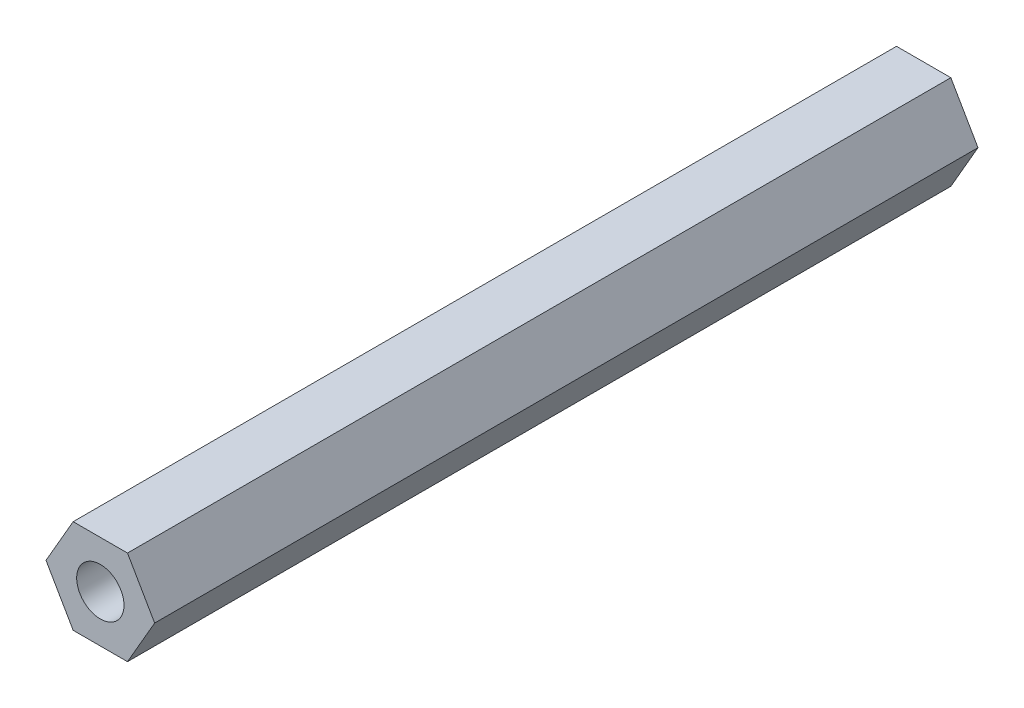
ISO-10303-21;
HEADER;
FILE_DESCRIPTION(('STEP AP214'),'2;1');
FILE_NAME('part.step','',(''),(''),'','','');
FILE_SCHEMA(('AUTOMOTIVE_DESIGN { 1 0 10303 214 1 1 1 1 }'));
ENDSEC;
DATA;
#1=APPLICATION_CONTEXT('core data for automotive mechanical design processes');
#2=APPLICATION_PROTOCOL_DEFINITION('international standard','automotive_design',2000,#1);
#3=PRODUCT_CONTEXT('',#1,'mechanical');
#4=PRODUCT('Part','Part','',(#3));
#5=PRODUCT_RELATED_PRODUCT_CATEGORY('part','',(#4));
#6=PRODUCT_DEFINITION_FORMATION('','',#4);
#7=PRODUCT_DEFINITION_CONTEXT('part definition',#1,'design');
#8=PRODUCT_DEFINITION('design','',#6,#7);
#9=PRODUCT_DEFINITION_SHAPE('','',#8);
#10=(LENGTH_UNIT() NAMED_UNIT(*) SI_UNIT(.MILLI.,.METRE.));
#11=(NAMED_UNIT(*) PLANE_ANGLE_UNIT() SI_UNIT($,.RADIAN.));
#12=(NAMED_UNIT(*) SI_UNIT($,.STERADIAN.) SOLID_ANGLE_UNIT());
#13=UNCERTAINTY_MEASURE_WITH_UNIT(LENGTH_MEASURE(1.E-05),#10,'distance_accuracy_value','');
#14=(GEOMETRIC_REPRESENTATION_CONTEXT(3) GLOBAL_UNCERTAINTY_ASSIGNED_CONTEXT((#13)) GLOBAL_UNIT_ASSIGNED_CONTEXT((#10,
#11,#12)) REPRESENTATION_CONTEXT('',''));
#15=CARTESIAN_POINT('',(0.,0.,0.));
#16=DIRECTION('',(0.,0.,1.));
#17=DIRECTION('',(1.,0.,0.));
#18=AXIS2_PLACEMENT_3D('',#15,#16,#17);
#19=CARTESIAN_POINT('',(2.3094010767585,-4.,70.));
#20=DIRECTION('',(-0.866025403784439,0.5,0.));
#21=DIRECTION('',(-0.5,-0.866025403784439,0.));
#22=AXIS2_PLACEMENT_3D('',#19,#20,#21);
#23=PLANE('',#22);
#24=DIRECTION('',(0.5,0.866025403784439,0.));
#25=VECTOR('',#24,1.);
#26=CARTESIAN_POINT('',(2.3094010767585,-4.,0.));
#27=LINE('',#26,#25);
#28=CARTESIAN_POINT('',(2.3094010767585,-4.,0.));
#29=VERTEX_POINT('',#28);
#30=CARTESIAN_POINT('',(4.61880215351701,0.,0.));
#31=VERTEX_POINT('',#30);
#32=EDGE_CURVE('E133',#29,#31,#27,.T.);
#33=ORIENTED_EDGE('',*,*,#32,.T.);
#34=DIRECTION('',(0.,0.,-1.));
#35=VECTOR('',#34,1.);
#36=CARTESIAN_POINT('',(4.61880215351701,0.,70.));
#37=LINE('',#36,#35);
#38=CARTESIAN_POINT('',(4.61880215351701,0.,70.));
#39=VERTEX_POINT('',#38);
#40=EDGE_CURVE('E11',#39,#31,#37,.T.);
#41=ORIENTED_EDGE('',*,*,#40,.F.);
#42=DIRECTION('',(0.5,0.866025403784439,0.));
#43=VECTOR('',#42,1.);
#44=CARTESIAN_POINT('',(2.3094010767585,-4.,70.));
#45=LINE('',#44,#43);
#46=CARTESIAN_POINT('',(2.3094010767585,-4.,70.));
#47=VERTEX_POINT('',#46);
#48=EDGE_CURVE('E151',#47,#39,#45,.T.);
#49=ORIENTED_EDGE('',*,*,#48,.F.);
#50=DIRECTION('',(0.,0.,-1.));
#51=VECTOR('',#50,1.);
#52=CARTESIAN_POINT('',(2.3094010767585,-4.,70.));
#53=LINE('',#52,#51);
#54=EDGE_CURVE('E128',#47,#29,#53,.T.);
#55=ORIENTED_EDGE('',*,*,#54,.T.);
#56=EDGE_LOOP('',(#33,#41,#49,#55));
#57=FACE_BOUND('',#56,.T.);
#58=ADVANCED_FACE('F44',(#57),#23,.F.);
#59=CARTESIAN_POINT('',(4.61880215351701,0.,70.));
#60=DIRECTION('',(-0.866025403784439,-0.5,0.));
#61=DIRECTION('',(0.5,-0.866025403784439,0.));
#62=AXIS2_PLACEMENT_3D('',#59,#60,#61);
#63=PLANE('',#62);
#64=DIRECTION('',(-0.5,0.866025403784439,0.));
#65=VECTOR('',#64,1.);
#66=CARTESIAN_POINT('',(4.61880215351701,0.,0.));
#67=LINE('',#66,#65);
#68=CARTESIAN_POINT('',(2.3094010767585,4.,0.));
#69=VERTEX_POINT('',#68);
#70=EDGE_CURVE('E136',#31,#69,#67,.T.);
#71=ORIENTED_EDGE('',*,*,#70,.T.);
#72=DIRECTION('',(0.,0.,-1.));
#73=VECTOR('',#72,1.);
#74=CARTESIAN_POINT('',(2.3094010767585,4.,70.));
#75=LINE('',#74,#73);
#76=CARTESIAN_POINT('',(2.3094010767585,4.,70.));
#77=VERTEX_POINT('',#76);
#78=EDGE_CURVE('E53',#77,#69,#75,.T.);
#79=ORIENTED_EDGE('',*,*,#78,.F.);
#80=DIRECTION('',(-0.5,0.866025403784439,0.));
#81=VECTOR('',#80,1.);
#82=CARTESIAN_POINT('',(4.61880215351701,0.,70.));
#83=LINE('',#82,#81);
#84=EDGE_CURVE('E97',#39,#77,#83,.T.);
#85=ORIENTED_EDGE('',*,*,#84,.F.);
#86=ORIENTED_EDGE('',*,*,#40,.T.);
#87=EDGE_LOOP('',(#71,#79,#85,#86));
#88=FACE_BOUND('',#87,.T.);
#89=ADVANCED_FACE('F182',(#88),#63,.F.);
#90=CARTESIAN_POINT('',(2.3094010767585,4.,70.));
#91=DIRECTION('',(0.,-1.,0.));
#92=DIRECTION('',(1.,0.,0.));
#93=AXIS2_PLACEMENT_3D('',#90,#91,#92);
#94=PLANE('',#93);
#95=DIRECTION('',(-1.,0.,0.));
#96=VECTOR('',#95,1.);
#97=CARTESIAN_POINT('',(2.3094010767585,4.,0.));
#98=LINE('',#97,#96);
#99=CARTESIAN_POINT('',(-2.3094010767585,4.,0.));
#100=VERTEX_POINT('',#99);
#101=EDGE_CURVE('E142',#69,#100,#98,.T.);
#102=ORIENTED_EDGE('',*,*,#101,.T.);
#103=DIRECTION('',(0.,0.,-1.));
#104=VECTOR('',#103,1.);
#105=CARTESIAN_POINT('',(-2.3094010767585,4.,70.));
#106=LINE('',#105,#104);
#107=CARTESIAN_POINT('',(-2.3094010767585,4.,70.));
#108=VERTEX_POINT('',#107);
#109=EDGE_CURVE('E121',#108,#100,#106,.T.);
#110=ORIENTED_EDGE('',*,*,#109,.F.);
#111=DIRECTION('',(-1.,0.,0.));
#112=VECTOR('',#111,1.);
#113=CARTESIAN_POINT('',(2.3094010767585,4.,70.));
#114=LINE('',#113,#112);
#115=EDGE_CURVE('E115',#77,#108,#114,.T.);
#116=ORIENTED_EDGE('',*,*,#115,.F.);
#117=ORIENTED_EDGE('',*,*,#78,.T.);
#118=EDGE_LOOP('',(#102,#110,#116,#117));
#119=FACE_BOUND('',#118,.T.);
#120=ADVANCED_FACE('F161',(#119),#94,.F.);
#121=CARTESIAN_POINT('',(-2.3094010767585,4.,70.));
#122=DIRECTION('',(0.866025403784439,-0.5,0.));
#123=DIRECTION('',(0.5,0.866025403784439,0.));
#124=AXIS2_PLACEMENT_3D('',#121,#122,#123);
#125=PLANE('',#124);
#126=DIRECTION('',(-0.5,-0.866025403784439,0.));
#127=VECTOR('',#126,1.);
#128=CARTESIAN_POINT('',(-2.3094010767585,4.,0.));
#129=LINE('',#128,#127);
#130=CARTESIAN_POINT('',(-4.61880215351701,0.,0.));
#131=VERTEX_POINT('',#130);
#132=EDGE_CURVE('E123',#100,#131,#129,.T.);
#133=ORIENTED_EDGE('',*,*,#132,.T.);
#134=DIRECTION('',(0.,0.,-1.));
#135=VECTOR('',#134,1.);
#136=CARTESIAN_POINT('',(-4.61880215351701,0.,70.));
#137=LINE('',#136,#135);
#138=CARTESIAN_POINT('',(-4.61880215351701,0.,70.));
#139=VERTEX_POINT('',#138);
#140=EDGE_CURVE('E119',#139,#131,#137,.T.);
#141=ORIENTED_EDGE('',*,*,#140,.F.);
#142=DIRECTION('',(-0.5,-0.866025403784439,0.));
#143=VECTOR('',#142,1.);
#144=CARTESIAN_POINT('',(-2.3094010767585,4.,70.));
#145=LINE('',#144,#143);
#146=EDGE_CURVE('E106',#108,#139,#145,.T.);
#147=ORIENTED_EDGE('',*,*,#146,.F.);
#148=ORIENTED_EDGE('',*,*,#109,.T.);
#149=EDGE_LOOP('',(#133,#141,#147,#148));
#150=FACE_BOUND('',#149,.T.);
#151=ADVANCED_FACE('F118',(#150),#125,.F.);
#152=CARTESIAN_POINT('',(-4.61880215351701,0.,70.));
#153=DIRECTION('',(0.866025403784439,0.5,0.));
#154=DIRECTION('',(-0.5,0.866025403784439,0.));
#155=AXIS2_PLACEMENT_3D('',#152,#153,#154);
#156=PLANE('',#155);
#157=DIRECTION('',(0.5,-0.866025403784439,0.));
#158=VECTOR('',#157,1.);
#159=CARTESIAN_POINT('',(-4.61880215351701,0.,0.));
#160=LINE('',#159,#158);
#161=CARTESIAN_POINT('',(-2.30940107675851,-4.,0.));
#162=VERTEX_POINT('',#161);
#163=EDGE_CURVE('E84',#131,#162,#160,.T.);
#164=ORIENTED_EDGE('',*,*,#163,.T.);
#165=DIRECTION('',(0.,0.,-1.));
#166=VECTOR('',#165,1.);
#167=CARTESIAN_POINT('',(-2.30940107675851,-4.,70.));
#168=LINE('',#167,#166);
#169=CARTESIAN_POINT('',(-2.30940107675851,-4.,70.));
#170=VERTEX_POINT('',#169);
#171=EDGE_CURVE('E122',#170,#162,#168,.T.);
#172=ORIENTED_EDGE('',*,*,#171,.F.);
#173=DIRECTION('',(0.5,-0.866025403784439,0.));
#174=VECTOR('',#173,1.);
#175=CARTESIAN_POINT('',(-4.61880215351701,0.,70.));
#176=LINE('',#175,#174);
#177=EDGE_CURVE('E109',#139,#170,#176,.T.);
#178=ORIENTED_EDGE('',*,*,#177,.F.);
#179=ORIENTED_EDGE('',*,*,#140,.T.);
#180=EDGE_LOOP('',(#164,#172,#178,#179));
#181=FACE_BOUND('',#180,.T.);
#182=ADVANCED_FACE('F127',(#181),#156,.F.);
#183=CARTESIAN_POINT('',(-2.30940107675851,-4.,70.));
#184=DIRECTION('',(0.,1.,0.));
#185=DIRECTION('',(0.,0.,1.));
#186=AXIS2_PLACEMENT_3D('',#183,#184,#185);
#187=PLANE('',#186);
#188=DIRECTION('',(1.,0.,0.));
#189=VECTOR('',#188,1.);
#190=CARTESIAN_POINT('',(-2.30940107675851,-4.,0.));
#191=LINE('',#190,#189);
#192=EDGE_CURVE('E93',#162,#29,#191,.T.);
#193=ORIENTED_EDGE('',*,*,#192,.T.);
#194=ORIENTED_EDGE('',*,*,#54,.F.);
#195=DIRECTION('',(1.,0.,0.));
#196=VECTOR('',#195,1.);
#197=CARTESIAN_POINT('',(-2.30940107675851,-4.,70.));
#198=LINE('',#197,#196);
#199=EDGE_CURVE('E62',#170,#47,#198,.T.);
#200=ORIENTED_EDGE('',*,*,#199,.F.);
#201=ORIENTED_EDGE('',*,*,#171,.T.);
#202=EDGE_LOOP('',(#193,#194,#200,#201));
#203=FACE_BOUND('',#202,.T.);
#204=ADVANCED_FACE('F169',(#203),#187,.F.);
#205=CARTESIAN_POINT('',(0.,0.,70.));
#206=DIRECTION('',(0.,0.,1.));
#207=DIRECTION('',(1.,0.,0.));
#208=AXIS2_PLACEMENT_3D('',#205,#206,#207);
#209=PLANE('',#208);
#210=CARTESIAN_POINT('',(0.,0.,70.));
#211=DIRECTION('',(0.,0.,1.));
#212=DIRECTION('',(1.,0.,0.));
#213=AXIS2_PLACEMENT_3D('',#210,#211,#212);
#214=CIRCLE('',#213,2.01);
#215=CARTESIAN_POINT('',(2.01,0.,70.));
#216=VERTEX_POINT('',#215);
#217=EDGE_CURVE('E266',#216,#216,#214,.T.);
#218=ORIENTED_EDGE('',*,*,#217,.F.);
#219=EDGE_LOOP('',(#218));
#220=FACE_BOUND('',#219,.T.);
#221=ORIENTED_EDGE('',*,*,#48,.T.);
#222=ORIENTED_EDGE('',*,*,#84,.T.);
#223=ORIENTED_EDGE('',*,*,#115,.T.);
#224=ORIENTED_EDGE('',*,*,#146,.T.);
#225=ORIENTED_EDGE('',*,*,#177,.T.);
#226=ORIENTED_EDGE('',*,*,#199,.T.);
#227=EDGE_LOOP('',(#221,#222,#223,#224,#225,#226));
#228=FACE_BOUND('',#227,.T.);
#229=ADVANCED_FACE('F107',(#220,#228),#209,.T.);
#230=CARTESIAN_POINT('',(0.,0.,0.));
#231=DIRECTION('',(0.,0.,1.));
#232=DIRECTION('',(1.,0.,0.));
#233=AXIS2_PLACEMENT_3D('',#230,#231,#232);
#234=PLANE('',#233);
#235=CARTESIAN_POINT('',(0.,0.,0.));
#236=DIRECTION('',(0.,0.,-1.));
#237=DIRECTION('',(-1.,0.,0.));
#238=AXIS2_PLACEMENT_3D('',#235,#236,#237);
#239=CIRCLE('',#238,2.01);
#240=CARTESIAN_POINT('',(-2.01,0.,0.));
#241=VERTEX_POINT('',#240);
#242=EDGE_CURVE('E264',#241,#241,#239,.T.);
#243=ORIENTED_EDGE('',*,*,#242,.F.);
#244=EDGE_LOOP('',(#243));
#245=FACE_BOUND('',#244,.T.);
#246=ORIENTED_EDGE('',*,*,#32,.F.);
#247=ORIENTED_EDGE('',*,*,#192,.F.);
#248=ORIENTED_EDGE('',*,*,#163,.F.);
#249=ORIENTED_EDGE('',*,*,#132,.F.);
#250=ORIENTED_EDGE('',*,*,#101,.F.);
#251=ORIENTED_EDGE('',*,*,#70,.F.);
#252=EDGE_LOOP('',(#246,#247,#248,#249,#250,#251));
#253=FACE_BOUND('',#252,.T.);
#254=ADVANCED_FACE('F163',(#245,#253),#234,.F.);
#255=CARTESIAN_POINT('',(0.,0.,10.));
#256=DIRECTION('',(0.,0.,-1.));
#257=DIRECTION('',(-1.,0.,0.));
#258=AXIS2_PLACEMENT_3D('',#255,#256,#257);
#259=CYLINDRICAL_SURFACE('',#258,2.01);
#260=CARTESIAN_POINT('',(0.,0.,10.));
#261=DIRECTION('',(0.,0.,-1.));
#262=DIRECTION('',(-1.,0.,0.));
#263=AXIS2_PLACEMENT_3D('',#260,#261,#262);
#264=CIRCLE('',#263,2.01);
#265=CARTESIAN_POINT('',(-2.01,0.,10.));
#266=VERTEX_POINT('',#265);
#267=EDGE_CURVE('E137',#266,#266,#264,.T.);
#268=ORIENTED_EDGE('',*,*,#267,.F.);
#269=EDGE_LOOP('',(#268));
#270=FACE_BOUND('',#269,.T.);
#271=ORIENTED_EDGE('',*,*,#242,.T.);
#272=EDGE_LOOP('',(#271));
#273=FACE_BOUND('',#272,.T.);
#274=ADVANCED_FACE('F222',(#270,#273),#259,.F.);
#275=CARTESIAN_POINT('',(0.,0.,10.));
#276=DIRECTION('',(0.,0.,-1.));
#277=DIRECTION('',(-1.,0.,0.));
#278=AXIS2_PLACEMENT_3D('',#275,#276,#277);
#279=PLANE('',#278);
#280=ORIENTED_EDGE('',*,*,#267,.T.);
#281=EDGE_LOOP('',(#280));
#282=FACE_BOUND('',#281,.T.);
#283=ADVANCED_FACE('F230',(#282),#279,.T.);
#284=CARTESIAN_POINT('',(0.,0.,60.));
#285=DIRECTION('',(0.,0.,1.));
#286=DIRECTION('',(1.,0.,0.));
#287=AXIS2_PLACEMENT_3D('',#284,#285,#286);
#288=CYLINDRICAL_SURFACE('',#287,2.01);
#289=CARTESIAN_POINT('',(0.,0.,60.));
#290=DIRECTION('',(0.,0.,1.));
#291=DIRECTION('',(1.,0.,0.));
#292=AXIS2_PLACEMENT_3D('',#289,#290,#291);
#293=CIRCLE('',#292,2.01);
#294=CARTESIAN_POINT('',(2.01,0.,60.));
#295=VERTEX_POINT('',#294);
#296=EDGE_CURVE('E263',#295,#295,#293,.T.);
#297=ORIENTED_EDGE('',*,*,#296,.F.);
#298=EDGE_LOOP('',(#297));
#299=FACE_BOUND('',#298,.T.);
#300=ORIENTED_EDGE('',*,*,#217,.T.);
#301=EDGE_LOOP('',(#300));
#302=FACE_BOUND('',#301,.T.);
#303=ADVANCED_FACE('F239',(#299,#302),#288,.F.);
#304=CARTESIAN_POINT('',(0.,0.,60.));
#305=DIRECTION('',(0.,0.,1.));
#306=DIRECTION('',(1.,0.,0.));
#307=AXIS2_PLACEMENT_3D('',#304,#305,#306);
#308=PLANE('',#307);
#309=ORIENTED_EDGE('',*,*,#296,.T.);
#310=EDGE_LOOP('',(#309));
#311=FACE_BOUND('',#310,.T.);
#312=ADVANCED_FACE('F246',(#311),#308,.T.);
#313=CLOSED_SHELL('',(#58,#89,#120,#151,#182,#204,#229,#254,#274,#283,#303,#312));
#314=MANIFOLD_SOLID_BREP('B2',#313);
#315=ADVANCED_BREP_SHAPE_REPRESENTATION('',(#18,#314),#14);
#316=SHAPE_DEFINITION_REPRESENTATION(#9,#315);
ENDSEC;
END-ISO-10303-21;
